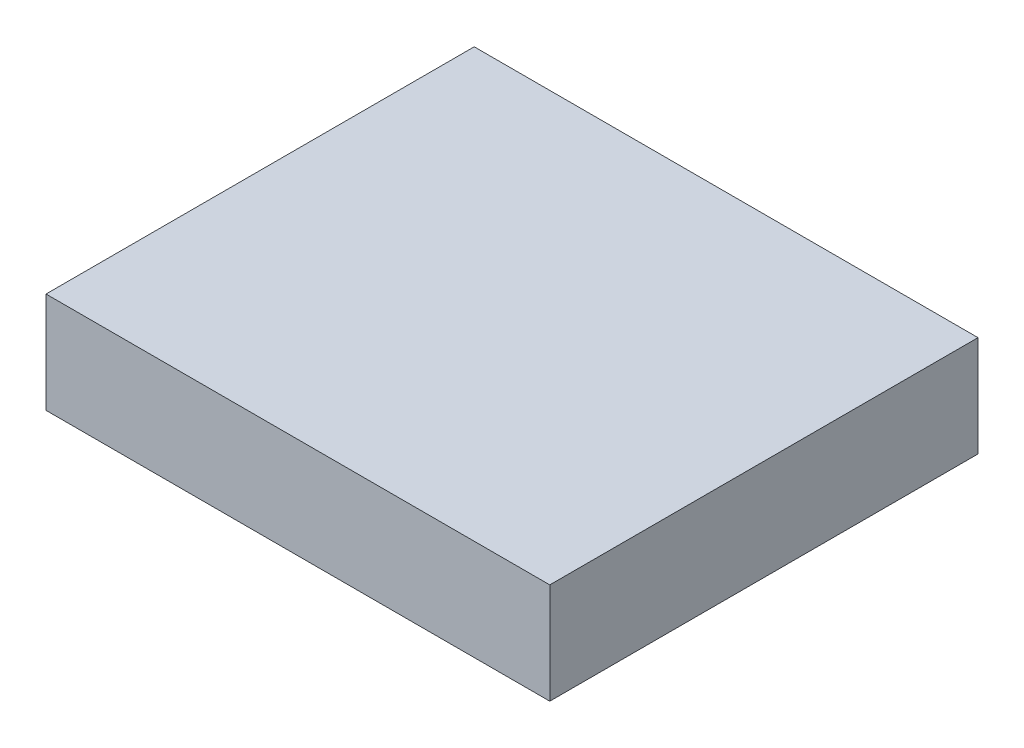
ISO-10303-21;
HEADER;
FILE_DESCRIPTION(('STEP AP214'),'2;1');
FILE_NAME('part.step','',(''),(''),'','','');
FILE_SCHEMA(('AUTOMOTIVE_DESIGN { 1 0 10303 214 1 1 1 1 }'));
ENDSEC;
DATA;
#1=APPLICATION_CONTEXT('core data for automotive mechanical design processes');
#2=APPLICATION_PROTOCOL_DEFINITION('international standard','automotive_design',2000,#1);
#3=PRODUCT_CONTEXT('',#1,'mechanical');
#4=PRODUCT('Part','Part','',(#3));
#5=PRODUCT_RELATED_PRODUCT_CATEGORY('part','',(#4));
#6=PRODUCT_DEFINITION_FORMATION('','',#4);
#7=PRODUCT_DEFINITION_CONTEXT('part definition',#1,'design');
#8=PRODUCT_DEFINITION('design','',#6,#7);
#9=PRODUCT_DEFINITION_SHAPE('','',#8);
#10=(LENGTH_UNIT() NAMED_UNIT(*) SI_UNIT(.MILLI.,.METRE.));
#11=(NAMED_UNIT(*) PLANE_ANGLE_UNIT() SI_UNIT($,.RADIAN.));
#12=(NAMED_UNIT(*) SI_UNIT($,.STERADIAN.) SOLID_ANGLE_UNIT());
#13=UNCERTAINTY_MEASURE_WITH_UNIT(LENGTH_MEASURE(1.E-05),#10,'distance_accuracy_value','');
#14=(GEOMETRIC_REPRESENTATION_CONTEXT(3) GLOBAL_UNCERTAINTY_ASSIGNED_CONTEXT((#13)) GLOBAL_UNIT_ASSIGNED_CONTEXT((#10,
#11,#12)) REPRESENTATION_CONTEXT('',''));
#15=CARTESIAN_POINT('',(0.,0.,0.));
#16=DIRECTION('',(0.,0.,1.));
#17=DIRECTION('',(1.,0.,0.));
#18=AXIS2_PLACEMENT_3D('',#15,#16,#17);
#19=CARTESIAN_POINT('',(0.499999988824,0.3,0.));
#20=DIRECTION('',(0.,0.,-1.));
#21=DIRECTION('',(0.,-1.,0.));
#22=AXIS2_PLACEMENT_3D('',#19,#20,#21);
#23=PLANE('',#22);
#24=DIRECTION('',(-1.,0.,0.));
#25=VECTOR('',#24,1.);
#26=CARTESIAN_POINT('',(0.499999988824,0.3,0.));
#27=LINE('',#26,#25);
#28=CARTESIAN_POINT('',(0.499999988824,0.3,0.));
#29=VERTEX_POINT('',#28);
#30=CARTESIAN_POINT('',(-0.499999988824,0.3,0.));
#31=VERTEX_POINT('',#30);
#32=EDGE_CURVE('E107',#29,#31,#27,.T.);
#33=ORIENTED_EDGE('',*,*,#32,.T.);
#34=DIRECTION('',(0.,1.,0.));
#35=VECTOR('',#34,1.);
#36=CARTESIAN_POINT('',(-0.499999988824,0.3,0.));
#37=LINE('',#36,#35);
#38=CARTESIAN_POINT('',(-0.499999988824,0.5,0.));
#39=VERTEX_POINT('',#38);
#40=EDGE_CURVE('E74',#31,#39,#37,.T.);
#41=ORIENTED_EDGE('',*,*,#40,.T.);
#42=DIRECTION('',(-1.,0.,0.));
#43=VECTOR('',#42,1.);
#44=CARTESIAN_POINT('',(0.499999988824,0.5,0.));
#45=LINE('',#44,#43);
#46=CARTESIAN_POINT('',(0.499999988824,0.5,0.));
#47=VERTEX_POINT('',#46);
#48=EDGE_CURVE('E85',#47,#39,#45,.T.);
#49=ORIENTED_EDGE('',*,*,#48,.F.);
#50=DIRECTION('',(0.,1.,0.));
#51=VECTOR('',#50,1.);
#52=CARTESIAN_POINT('',(0.499999988824,0.3,0.));
#53=LINE('',#52,#51);
#54=EDGE_CURVE('E11',#29,#47,#53,.T.);
#55=ORIENTED_EDGE('',*,*,#54,.F.);
#56=EDGE_LOOP('',(#33,#41,#49,#55));
#57=FACE_BOUND('',#56,.T.);
#58=ADVANCED_FACE('F17',(#57),#23,.T.);
#59=CARTESIAN_POINT('',(0.499999988824,0.3,0.85));
#60=DIRECTION('',(1.,0.,0.));
#61=DIRECTION('',(0.,1.,0.));
#62=AXIS2_PLACEMENT_3D('',#59,#60,#61);
#63=PLANE('',#62);
#64=DIRECTION('',(0.,0.,-1.));
#65=VECTOR('',#64,1.);
#66=CARTESIAN_POINT('',(0.499999988824,0.3,0.85));
#67=LINE('',#66,#65);
#68=CARTESIAN_POINT('',(0.499999988824,0.3,0.85));
#69=VERTEX_POINT('',#68);
#70=EDGE_CURVE('E102',#69,#29,#67,.T.);
#71=ORIENTED_EDGE('',*,*,#70,.T.);
#72=ORIENTED_EDGE('',*,*,#54,.T.);
#73=DIRECTION('',(0.,0.,-1.));
#74=VECTOR('',#73,1.);
#75=CARTESIAN_POINT('',(0.499999988824,0.5,0.85));
#76=LINE('',#75,#74);
#77=CARTESIAN_POINT('',(0.499999988824,0.5,0.85));
#78=VERTEX_POINT('',#77);
#79=EDGE_CURVE('E21',#78,#47,#76,.T.);
#80=ORIENTED_EDGE('',*,*,#79,.F.);
#81=DIRECTION('',(0.,1.,0.));
#82=VECTOR('',#81,1.);
#83=CARTESIAN_POINT('',(0.499999988824,0.3,0.85));
#84=LINE('',#83,#82);
#85=EDGE_CURVE('E28',#69,#78,#84,.T.);
#86=ORIENTED_EDGE('',*,*,#85,.F.);
#87=EDGE_LOOP('',(#71,#72,#80,#86));
#88=FACE_BOUND('',#87,.T.);
#89=ADVANCED_FACE('F158',(#88),#63,.T.);
#90=CARTESIAN_POINT('',(-0.499999988824,0.3,0.85));
#91=DIRECTION('',(0.,0.,1.));
#92=DIRECTION('',(1.,0.,0.));
#93=AXIS2_PLACEMENT_3D('',#90,#91,#92);
#94=PLANE('',#93);
#95=DIRECTION('',(1.,0.,0.));
#96=VECTOR('',#95,1.);
#97=CARTESIAN_POINT('',(-0.499999988824,0.3,0.85));
#98=LINE('',#97,#96);
#99=CARTESIAN_POINT('',(-0.499999988824,0.3,0.85));
#100=VERTEX_POINT('',#99);
#101=EDGE_CURVE('E96',#100,#69,#98,.T.);
#102=ORIENTED_EDGE('',*,*,#101,.T.);
#103=ORIENTED_EDGE('',*,*,#85,.T.);
#104=DIRECTION('',(1.,0.,0.));
#105=VECTOR('',#104,1.);
#106=CARTESIAN_POINT('',(-0.499999988824,0.5,0.85));
#107=LINE('',#106,#105);
#108=CARTESIAN_POINT('',(-0.499999988824,0.5,0.85));
#109=VERTEX_POINT('',#108);
#110=EDGE_CURVE('E88',#109,#78,#107,.T.);
#111=ORIENTED_EDGE('',*,*,#110,.F.);
#112=DIRECTION('',(0.,1.,0.));
#113=VECTOR('',#112,1.);
#114=CARTESIAN_POINT('',(-0.499999988824,0.3,0.85));
#115=LINE('',#114,#113);
#116=EDGE_CURVE('E61',#100,#109,#115,.T.);
#117=ORIENTED_EDGE('',*,*,#116,.F.);
#118=EDGE_LOOP('',(#102,#103,#111,#117));
#119=FACE_BOUND('',#118,.T.);
#120=ADVANCED_FACE('F89',(#119),#94,.T.);
#121=CARTESIAN_POINT('',(-0.499999988824,0.3,0.));
#122=DIRECTION('',(-1.,0.,0.));
#123=DIRECTION('',(0.,0.,1.));
#124=AXIS2_PLACEMENT_3D('',#121,#122,#123);
#125=PLANE('',#124);
#126=DIRECTION('',(0.,0.,1.));
#127=VECTOR('',#126,1.);
#128=CARTESIAN_POINT('',(-0.499999988824,0.3,0.));
#129=LINE('',#128,#127);
#130=EDGE_CURVE('E83',#31,#100,#129,.T.);
#131=ORIENTED_EDGE('',*,*,#130,.T.);
#132=ORIENTED_EDGE('',*,*,#116,.T.);
#133=DIRECTION('',(0.,0.,1.));
#134=VECTOR('',#133,1.);
#135=CARTESIAN_POINT('',(-0.499999988824,0.5,0.));
#136=LINE('',#135,#134);
#137=EDGE_CURVE('E81',#39,#109,#136,.T.);
#138=ORIENTED_EDGE('',*,*,#137,.F.);
#139=ORIENTED_EDGE('',*,*,#40,.F.);
#140=EDGE_LOOP('',(#131,#132,#138,#139));
#141=FACE_BOUND('',#140,.T.);
#142=ADVANCED_FACE('F19',(#141),#125,.T.);
#143=CARTESIAN_POINT('',(0.,0.5,0.425));
#144=DIRECTION('',(0.,1.,0.));
#145=DIRECTION('',(1.,0.,0.));
#146=AXIS2_PLACEMENT_3D('',#143,#144,#145);
#147=PLANE('',#146);
#148=ORIENTED_EDGE('',*,*,#137,.T.);
#149=ORIENTED_EDGE('',*,*,#110,.T.);
#150=ORIENTED_EDGE('',*,*,#79,.T.);
#151=ORIENTED_EDGE('',*,*,#48,.T.);
#152=EDGE_LOOP('',(#148,#149,#150,#151));
#153=FACE_BOUND('',#152,.T.);
#154=ADVANCED_FACE('F94',(#153),#147,.T.);
#155=CARTESIAN_POINT('',(0.,0.3,0.425));
#156=DIRECTION('',(0.,1.,0.));
#157=DIRECTION('',(1.,0.,0.));
#158=AXIS2_PLACEMENT_3D('',#155,#156,#157);
#159=PLANE('',#158);
#160=ORIENTED_EDGE('',*,*,#130,.F.);
#161=ORIENTED_EDGE('',*,*,#32,.F.);
#162=ORIENTED_EDGE('',*,*,#70,.F.);
#163=ORIENTED_EDGE('',*,*,#101,.F.);
#164=EDGE_LOOP('',(#160,#161,#162,#163));
#165=FACE_BOUND('',#164,.T.);
#166=ADVANCED_FACE('F176',(#165),#159,.F.);
#167=CLOSED_SHELL('',(#58,#89,#120,#142,#154,#166));
#168=MANIFOLD_SOLID_BREP('B1',#167);
#169=ADVANCED_BREP_SHAPE_REPRESENTATION('',(#18,#168),#14);
#170=SHAPE_DEFINITION_REPRESENTATION(#9,#169);
ENDSEC;
END-ISO-10303-21;
